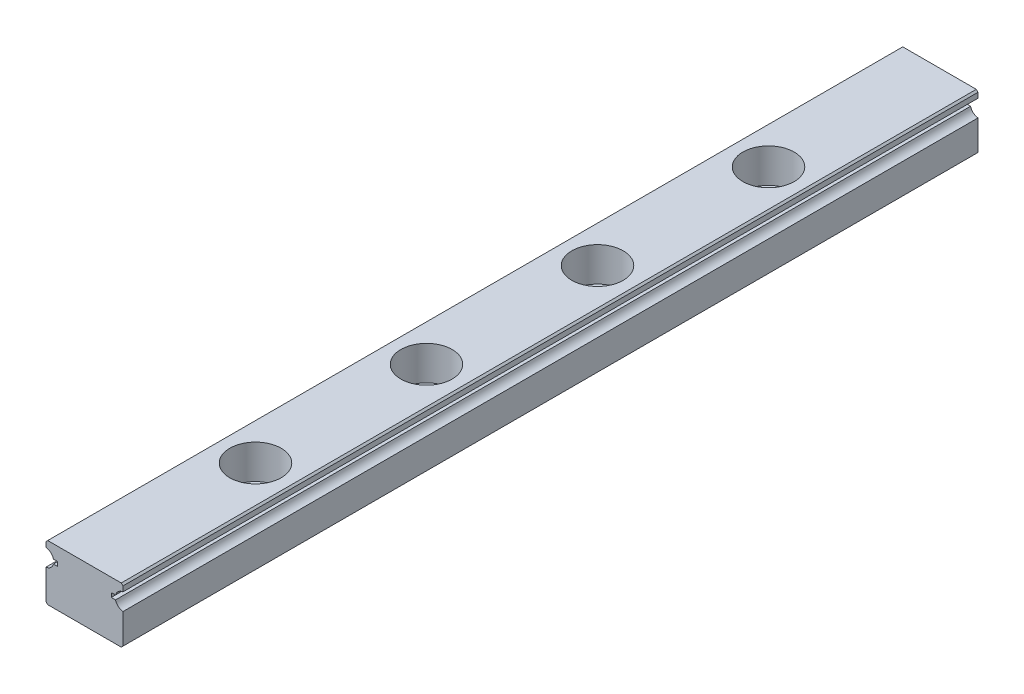
ISO-10303-21;
HEADER;
FILE_DESCRIPTION(('STEP AP214'),'2;1');
FILE_NAME('part.step','',(''),(''),'','','');
FILE_SCHEMA(('AUTOMOTIVE_DESIGN { 1 0 10303 214 1 1 1 1 }'));
ENDSEC;
DATA;
#1=APPLICATION_CONTEXT('core data for automotive mechanical design processes');
#2=APPLICATION_PROTOCOL_DEFINITION('international standard','automotive_design',2000,#1);
#3=PRODUCT_CONTEXT('',#1,'mechanical');
#4=PRODUCT('Part','Part','',(#3));
#5=PRODUCT_RELATED_PRODUCT_CATEGORY('part','',(#4));
#6=PRODUCT_DEFINITION_FORMATION('','',#4);
#7=PRODUCT_DEFINITION_CONTEXT('part definition',#1,'design');
#8=PRODUCT_DEFINITION('design','',#6,#7);
#9=PRODUCT_DEFINITION_SHAPE('','',#8);
#10=(LENGTH_UNIT() NAMED_UNIT(*) SI_UNIT(.MILLI.,.METRE.));
#11=(NAMED_UNIT(*) PLANE_ANGLE_UNIT() SI_UNIT($,.RADIAN.));
#12=(NAMED_UNIT(*) SI_UNIT($,.STERADIAN.) SOLID_ANGLE_UNIT());
#13=UNCERTAINTY_MEASURE_WITH_UNIT(LENGTH_MEASURE(1.E-05),#10,'distance_accuracy_value','');
#14=(GEOMETRIC_REPRESENTATION_CONTEXT(3) GLOBAL_UNCERTAINTY_ASSIGNED_CONTEXT((#13)) GLOBAL_UNIT_ASSIGNED_CONTEXT((#10,
#11,#12)) REPRESENTATION_CONTEXT('',''));
#15=CARTESIAN_POINT('',(0.,0.,0.));
#16=DIRECTION('',(0.,0.,1.));
#17=DIRECTION('',(1.,0.,0.));
#18=AXIS2_PLACEMENT_3D('',#15,#16,#17);
#19=CARTESIAN_POINT('',(-4.6,0.,100.));
#20=DIRECTION('',(0.,0.,-1.));
#21=DIRECTION('',(-1.,0.,0.));
#22=AXIS2_PLACEMENT_3D('',#19,#20,#21);
#23=CYLINDRICAL_SURFACE('',#22,1.);
#24=CARTESIAN_POINT('',(-4.6,0.,0.));
#25=DIRECTION('',(0.,0.,-1.));
#26=DIRECTION('',(-1.,0.,0.));
#27=AXIS2_PLACEMENT_3D('',#24,#25,#26);
#28=CIRCLE('',#27,1.);
#29=CARTESIAN_POINT('',(-4.5,0.99498743710662,0.));
#30=VERTEX_POINT('',#29);
#31=CARTESIAN_POINT('',(-3.63175416344815,0.25,0.));
#32=VERTEX_POINT('',#31);
#33=EDGE_CURVE('E206',#30,#32,#28,.T.);
#34=ORIENTED_EDGE('',*,*,#33,.T.);
#35=DIRECTION('',(0.,0.,-1.));
#36=VECTOR('',#35,1.);
#37=CARTESIAN_POINT('',(-3.63175416344815,0.25,100.));
#38=LINE('',#37,#36);
#39=CARTESIAN_POINT('',(-3.63175416344815,0.25,100.));
#40=VERTEX_POINT('',#39);
#41=EDGE_CURVE('E12',#40,#32,#38,.T.);
#42=ORIENTED_EDGE('',*,*,#41,.F.);
#43=CARTESIAN_POINT('',(-4.6,0.,100.));
#44=DIRECTION('',(0.,0.,-1.));
#45=DIRECTION('',(-1.,0.,0.));
#46=AXIS2_PLACEMENT_3D('',#43,#44,#45);
#47=CIRCLE('',#46,1.);
#48=CARTESIAN_POINT('',(-4.5,0.99498743710662,100.));
#49=VERTEX_POINT('',#48);
#50=EDGE_CURVE('E245',#49,#40,#47,.T.);
#51=ORIENTED_EDGE('',*,*,#50,.F.);
#52=DIRECTION('',(0.,0.,-1.));
#53=VECTOR('',#52,1.);
#54=CARTESIAN_POINT('',(-4.5,0.99498743710662,100.));
#55=LINE('',#54,#53);
#56=EDGE_CURVE('E202',#49,#30,#55,.T.);
#57=ORIENTED_EDGE('',*,*,#56,.T.);
#58=EDGE_LOOP('',(#34,#42,#51,#57));
#59=FACE_BOUND('',#58,.T.);
#60=ADVANCED_FACE('F38',(#59),#23,.F.);
#61=CARTESIAN_POINT('',(-3.63175416344815,0.25,100.));
#62=DIRECTION('',(0.,1.,0.));
#63=DIRECTION('',(-1.,0.,0.));
#64=AXIS2_PLACEMENT_3D('',#61,#62,#63);
#65=PLANE('',#64);
#66=DIRECTION('',(1.,0.,0.));
#67=VECTOR('',#66,1.);
#68=CARTESIAN_POINT('',(-3.63175416344815,0.25,0.));
#69=LINE('',#68,#67);
#70=CARTESIAN_POINT('',(-3.13175416344815,0.25,0.));
#71=VERTEX_POINT('',#70);
#72=EDGE_CURVE('E209',#32,#71,#69,.T.);
#73=ORIENTED_EDGE('',*,*,#72,.T.);
#74=DIRECTION('',(0.,0.,-1.));
#75=VECTOR('',#74,1.);
#76=CARTESIAN_POINT('',(-3.13175416344815,0.25,100.));
#77=LINE('',#76,#75);
#78=CARTESIAN_POINT('',(-3.13175416344815,0.25,100.));
#79=VERTEX_POINT('',#78);
#80=EDGE_CURVE('E46',#79,#71,#77,.T.);
#81=ORIENTED_EDGE('',*,*,#80,.F.);
#82=DIRECTION('',(1.,0.,0.));
#83=VECTOR('',#82,1.);
#84=CARTESIAN_POINT('',(-3.63175416344815,0.25,100.));
#85=LINE('',#84,#83);
#86=EDGE_CURVE('E133',#40,#79,#85,.T.);
#87=ORIENTED_EDGE('',*,*,#86,.F.);
#88=ORIENTED_EDGE('',*,*,#41,.T.);
#89=EDGE_LOOP('',(#73,#81,#87,#88));
#90=FACE_BOUND('',#89,.T.);
#91=ADVANCED_FACE('F363',(#90),#65,.F.);
#92=CARTESIAN_POINT('',(-3.13175416344815,-0.25,100.));
#93=DIRECTION('',(1.,0.,0.));
#94=DIRECTION('',(0.,0.,-1.));
#95=AXIS2_PLACEMENT_3D('',#92,#93,#94);
#96=PLANE('',#95);
#97=DIRECTION('',(0.,-1.,0.));
#98=VECTOR('',#97,1.);
#99=CARTESIAN_POINT('',(-3.13175416344815,-0.25,0.));
#100=LINE('',#99,#98);
#101=CARTESIAN_POINT('',(-3.13175416344815,-0.25,0.));
#102=VERTEX_POINT('',#101);
#103=EDGE_CURVE('E212',#71,#102,#100,.T.);
#104=ORIENTED_EDGE('',*,*,#103,.T.);
#105=DIRECTION('',(0.,0.,-1.));
#106=VECTOR('',#105,1.);
#107=CARTESIAN_POINT('',(-3.13175416344815,-0.25,100.));
#108=LINE('',#107,#106);
#109=CARTESIAN_POINT('',(-3.13175416344815,-0.25,100.));
#110=VERTEX_POINT('',#109);
#111=EDGE_CURVE('E288',#110,#102,#108,.T.);
#112=ORIENTED_EDGE('',*,*,#111,.F.);
#113=DIRECTION('',(0.,-1.,0.));
#114=VECTOR('',#113,1.);
#115=CARTESIAN_POINT('',(-3.13175416344815,-0.25,100.));
#116=LINE('',#115,#114);
#117=EDGE_CURVE('E296',#79,#110,#116,.T.);
#118=ORIENTED_EDGE('',*,*,#117,.F.);
#119=ORIENTED_EDGE('',*,*,#80,.T.);
#120=EDGE_LOOP('',(#104,#112,#118,#119));
#121=FACE_BOUND('',#120,.T.);
#122=ADVANCED_FACE('F294',(#121),#96,.F.);
#123=CARTESIAN_POINT('',(-3.63175416344815,-0.25,100.));
#124=DIRECTION('',(0.,-1.,0.));
#125=DIRECTION('',(0.,0.,-1.));
#126=AXIS2_PLACEMENT_3D('',#123,#124,#125);
#127=PLANE('',#126);
#128=DIRECTION('',(-1.,0.,0.));
#129=VECTOR('',#128,1.);
#130=CARTESIAN_POINT('',(-3.63175416344815,-0.25,0.));
#131=LINE('',#130,#129);
#132=CARTESIAN_POINT('',(-3.63175416344815,-0.25,0.));
#133=VERTEX_POINT('',#132);
#134=EDGE_CURVE('E214',#102,#133,#131,.T.);
#135=ORIENTED_EDGE('',*,*,#134,.T.);
#136=DIRECTION('',(0.,0.,-1.));
#137=VECTOR('',#136,1.);
#138=CARTESIAN_POINT('',(-3.63175416344815,-0.25,100.));
#139=LINE('',#138,#137);
#140=CARTESIAN_POINT('',(-3.63175416344815,-0.25,100.));
#141=VERTEX_POINT('',#140);
#142=EDGE_CURVE('E285',#141,#133,#139,.T.);
#143=ORIENTED_EDGE('',*,*,#142,.F.);
#144=DIRECTION('',(-1.,0.,0.));
#145=VECTOR('',#144,1.);
#146=CARTESIAN_POINT('',(-3.63175416344815,-0.25,100.));
#147=LINE('',#146,#145);
#148=EDGE_CURVE('E314',#110,#141,#147,.T.);
#149=ORIENTED_EDGE('',*,*,#148,.F.);
#150=ORIENTED_EDGE('',*,*,#111,.T.);
#151=EDGE_LOOP('',(#135,#143,#149,#150));
#152=FACE_BOUND('',#151,.T.);
#153=ADVANCED_FACE('F305',(#152),#127,.F.);
#154=CARTESIAN_POINT('',(-4.6,0.,100.));
#155=DIRECTION('',(0.,0.,-1.));
#156=DIRECTION('',(-1.,0.,0.));
#157=AXIS2_PLACEMENT_3D('',#154,#155,#156);
#158=CYLINDRICAL_SURFACE('',#157,1.);
#159=CARTESIAN_POINT('',(-4.6,0.,0.));
#160=DIRECTION('',(0.,0.,-1.));
#161=DIRECTION('',(-1.,0.,0.));
#162=AXIS2_PLACEMENT_3D('',#159,#160,#161);
#163=CIRCLE('',#162,1.);
#164=CARTESIAN_POINT('',(-4.5,-0.99498743710662,0.));
#165=VERTEX_POINT('',#164);
#166=EDGE_CURVE('E216',#133,#165,#163,.T.);
#167=ORIENTED_EDGE('',*,*,#166,.T.);
#168=DIRECTION('',(0.,0.,-1.));
#169=VECTOR('',#168,1.);
#170=CARTESIAN_POINT('',(-4.5,-0.99498743710662,100.));
#171=LINE('',#170,#169);
#172=CARTESIAN_POINT('',(-4.5,-0.99498743710662,100.));
#173=VERTEX_POINT('',#172);
#174=EDGE_CURVE('E282',#173,#165,#171,.T.);
#175=ORIENTED_EDGE('',*,*,#174,.F.);
#176=CARTESIAN_POINT('',(-4.6,0.,100.));
#177=DIRECTION('',(0.,0.,-1.));
#178=DIRECTION('',(-1.,0.,0.));
#179=AXIS2_PLACEMENT_3D('',#176,#177,#178);
#180=CIRCLE('',#179,1.);
#181=EDGE_CURVE('E311',#141,#173,#180,.T.);
#182=ORIENTED_EDGE('',*,*,#181,.F.);
#183=ORIENTED_EDGE('',*,*,#142,.T.);
#184=EDGE_LOOP('',(#167,#175,#182,#183));
#185=FACE_BOUND('',#184,.T.);
#186=ADVANCED_FACE('F309',(#185),#158,.F.);
#187=CARTESIAN_POINT('',(-4.5,-4.5,100.));
#188=DIRECTION('',(1.,0.,0.));
#189=DIRECTION('',(0.,1.,0.));
#190=AXIS2_PLACEMENT_3D('',#187,#188,#189);
#191=PLANE('',#190);
#192=DIRECTION('',(0.,-1.,0.));
#193=VECTOR('',#192,1.);
#194=CARTESIAN_POINT('',(-4.5,-4.5,0.));
#195=LINE('',#194,#193);
#196=CARTESIAN_POINT('',(-4.5,-4.5,0.));
#197=VERTEX_POINT('',#196);
#198=EDGE_CURVE('E218',#165,#197,#195,.T.);
#199=ORIENTED_EDGE('',*,*,#198,.T.);
#200=DIRECTION('',(0.,0.,-1.));
#201=VECTOR('',#200,1.);
#202=CARTESIAN_POINT('',(-4.5,-4.5,100.));
#203=LINE('',#202,#201);
#204=CARTESIAN_POINT('',(-4.5,-4.5,100.));
#205=VERTEX_POINT('',#204);
#206=EDGE_CURVE('E279',#205,#197,#203,.T.);
#207=ORIENTED_EDGE('',*,*,#206,.F.);
#208=DIRECTION('',(0.,-1.,0.));
#209=VECTOR('',#208,1.);
#210=CARTESIAN_POINT('',(-4.5,-4.5,100.));
#211=LINE('',#210,#209);
#212=EDGE_CURVE('E313',#173,#205,#211,.T.);
#213=ORIENTED_EDGE('',*,*,#212,.F.);
#214=ORIENTED_EDGE('',*,*,#174,.T.);
#215=EDGE_LOOP('',(#199,#207,#213,#214));
#216=FACE_BOUND('',#215,.T.);
#217=ADVANCED_FACE('F376',(#216),#191,.F.);
#218=CARTESIAN_POINT('',(-4.5,-4.5,100.));
#219=DIRECTION('',(0.707106781186547,0.707106781186547,0.));
#220=DIRECTION('',(-0.707106781186548,0.707106781186548,0.));
#221=AXIS2_PLACEMENT_3D('',#218,#219,#220);
#222=PLANE('',#221);
#223=DIRECTION('',(0.707106781186547,-0.707106781186547,0.));
#224=VECTOR('',#223,1.);
#225=CARTESIAN_POINT('',(-4.5,-4.5,0.));
#226=LINE('',#225,#224);
#227=CARTESIAN_POINT('',(-4.3,-4.7,0.));
#228=VERTEX_POINT('',#227);
#229=EDGE_CURVE('E220',#197,#228,#226,.T.);
#230=ORIENTED_EDGE('',*,*,#229,.T.);
#231=DIRECTION('',(0.,0.,-1.));
#232=VECTOR('',#231,1.);
#233=CARTESIAN_POINT('',(-4.3,-4.7,100.));
#234=LINE('',#233,#232);
#235=CARTESIAN_POINT('',(-4.3,-4.7,100.));
#236=VERTEX_POINT('',#235);
#237=EDGE_CURVE('E276',#236,#228,#234,.T.);
#238=ORIENTED_EDGE('',*,*,#237,.F.);
#239=DIRECTION('',(0.707106781186547,-0.707106781186547,0.));
#240=VECTOR('',#239,1.);
#241=CARTESIAN_POINT('',(-4.5,-4.5,100.));
#242=LINE('',#241,#240);
#243=EDGE_CURVE('E316',#205,#236,#242,.T.);
#244=ORIENTED_EDGE('',*,*,#243,.F.);
#245=ORIENTED_EDGE('',*,*,#206,.T.);
#246=EDGE_LOOP('',(#230,#238,#244,#245));
#247=FACE_BOUND('',#246,.T.);
#248=ADVANCED_FACE('F379',(#247),#222,.F.);
#249=CARTESIAN_POINT('',(-4.3,-4.7,100.));
#250=DIRECTION('',(0.,1.,0.));
#251=DIRECTION('',(-1.,0.,0.));
#252=AXIS2_PLACEMENT_3D('',#249,#250,#251);
#253=PLANE('',#252);
#254=CARTESIAN_POINT('',(0.,-4.7,80.));
#255=DIRECTION('',(0.,1.,0.));
#256=DIRECTION('',(-1.,0.,0.));
#257=AXIS2_PLACEMENT_3D('',#254,#255,#256);
#258=CIRCLE('',#257,1.75);
#259=CARTESIAN_POINT('',(-1.74999999999992,-4.7,80.));
#260=VERTEX_POINT('',#259);
#261=EDGE_CURVE('E612',#260,#260,#258,.T.);
#262=ORIENTED_EDGE('',*,*,#261,.T.);
#263=EDGE_LOOP('',(#262));
#264=FACE_BOUND('',#263,.T.);
#265=CARTESIAN_POINT('',(0.,-4.7,60.));
#266=DIRECTION('',(0.,1.,0.));
#267=DIRECTION('',(-1.,0.,0.));
#268=AXIS2_PLACEMENT_3D('',#265,#266,#267);
#269=CIRCLE('',#268,1.75);
#270=CARTESIAN_POINT('',(-1.74999999999996,-4.7,60.));
#271=VERTEX_POINT('',#270);
#272=EDGE_CURVE('E622',#271,#271,#269,.T.);
#273=ORIENTED_EDGE('',*,*,#272,.T.);
#274=EDGE_LOOP('',(#273));
#275=FACE_BOUND('',#274,.T.);
#276=CARTESIAN_POINT('',(0.,-4.7,20.));
#277=DIRECTION('',(0.,1.,0.));
#278=DIRECTION('',(-1.,0.,0.));
#279=AXIS2_PLACEMENT_3D('',#276,#277,#278);
#280=CIRCLE('',#279,1.75);
#281=CARTESIAN_POINT('',(-1.75000000000003,-4.7,20.));
#282=VERTEX_POINT('',#281);
#283=EDGE_CURVE('E441',#282,#282,#280,.T.);
#284=ORIENTED_EDGE('',*,*,#283,.T.);
#285=EDGE_LOOP('',(#284));
#286=FACE_BOUND('',#285,.T.);
#287=CARTESIAN_POINT('',(0.,-4.7,40.));
#288=DIRECTION('',(0.,1.,0.));
#289=DIRECTION('',(-1.,0.,0.));
#290=AXIS2_PLACEMENT_3D('',#287,#288,#289);
#291=CIRCLE('',#290,1.75);
#292=CARTESIAN_POINT('',(-1.75,-4.7,40.));
#293=VERTEX_POINT('',#292);
#294=EDGE_CURVE('E210',#293,#293,#291,.T.);
#295=ORIENTED_EDGE('',*,*,#294,.T.);
#296=EDGE_LOOP('',(#295));
#297=FACE_BOUND('',#296,.T.);
#298=DIRECTION('',(1.,0.,0.));
#299=VECTOR('',#298,1.);
#300=CARTESIAN_POINT('',(-4.3,-4.7,0.));
#301=LINE('',#300,#299);
#302=CARTESIAN_POINT('',(4.3,-4.7,0.));
#303=VERTEX_POINT('',#302);
#304=EDGE_CURVE('E222',#228,#303,#301,.T.);
#305=ORIENTED_EDGE('',*,*,#304,.T.);
#306=DIRECTION('',(0.,0.,-1.));
#307=VECTOR('',#306,1.);
#308=CARTESIAN_POINT('',(4.3,-4.7,100.));
#309=LINE('',#308,#307);
#310=CARTESIAN_POINT('',(4.3,-4.7,100.));
#311=VERTEX_POINT('',#310);
#312=EDGE_CURVE('E273',#311,#303,#309,.T.);
#313=ORIENTED_EDGE('',*,*,#312,.F.);
#314=DIRECTION('',(1.,0.,0.));
#315=VECTOR('',#314,1.);
#316=CARTESIAN_POINT('',(-4.3,-4.7,100.));
#317=LINE('',#316,#315);
#318=EDGE_CURVE('E322',#236,#311,#317,.T.);
#319=ORIENTED_EDGE('',*,*,#318,.F.);
#320=ORIENTED_EDGE('',*,*,#237,.T.);
#321=EDGE_LOOP('',(#305,#313,#319,#320));
#322=FACE_BOUND('',#321,.T.);
#323=ADVANCED_FACE('F383',(#264,#275,#286,#297,#322),#253,.F.);
#324=CARTESIAN_POINT('',(4.3,-4.7,100.));
#325=DIRECTION('',(-0.707106781186549,0.707106781186546,0.));
#326=DIRECTION('',(-0.707106781186546,-0.707106781186549,0.));
#327=AXIS2_PLACEMENT_3D('',#324,#325,#326);
#328=PLANE('',#327);
#329=DIRECTION('',(0.707106781186546,0.707106781186549,0.));
#330=VECTOR('',#329,1.);
#331=CARTESIAN_POINT('',(4.3,-4.7,0.));
#332=LINE('',#331,#330);
#333=CARTESIAN_POINT('',(4.5,-4.5,0.));
#334=VERTEX_POINT('',#333);
#335=EDGE_CURVE('E224',#303,#334,#332,.T.);
#336=ORIENTED_EDGE('',*,*,#335,.T.);
#337=DIRECTION('',(0.,0.,-1.));
#338=VECTOR('',#337,1.);
#339=CARTESIAN_POINT('',(4.5,-4.5,100.));
#340=LINE('',#339,#338);
#341=CARTESIAN_POINT('',(4.5,-4.5,100.));
#342=VERTEX_POINT('',#341);
#343=EDGE_CURVE('E270',#342,#334,#340,.T.);
#344=ORIENTED_EDGE('',*,*,#343,.F.);
#345=DIRECTION('',(0.707106781186546,0.707106781186549,0.));
#346=VECTOR('',#345,1.);
#347=CARTESIAN_POINT('',(4.3,-4.7,100.));
#348=LINE('',#347,#346);
#349=EDGE_CURVE('E324',#311,#342,#348,.T.);
#350=ORIENTED_EDGE('',*,*,#349,.F.);
#351=ORIENTED_EDGE('',*,*,#312,.T.);
#352=EDGE_LOOP('',(#336,#344,#350,#351));
#353=FACE_BOUND('',#352,.T.);
#354=ADVANCED_FACE('F387',(#353),#328,.F.);
#355=CARTESIAN_POINT('',(4.5,-4.5,100.));
#356=DIRECTION('',(-1.,0.,0.));
#357=DIRECTION('',(0.,-1.,0.));
#358=AXIS2_PLACEMENT_3D('',#355,#356,#357);
#359=PLANE('',#358);
#360=DIRECTION('',(0.,1.,0.));
#361=VECTOR('',#360,1.);
#362=CARTESIAN_POINT('',(4.5,-4.5,0.));
#363=LINE('',#362,#361);
#364=CARTESIAN_POINT('',(4.5,-0.99498743710662,0.));
#365=VERTEX_POINT('',#364);
#366=EDGE_CURVE('E226',#334,#365,#363,.T.);
#367=ORIENTED_EDGE('',*,*,#366,.T.);
#368=DIRECTION('',(0.,0.,-1.));
#369=VECTOR('',#368,1.);
#370=CARTESIAN_POINT('',(4.5,-0.99498743710662,100.));
#371=LINE('',#370,#369);
#372=CARTESIAN_POINT('',(4.5,-0.99498743710662,100.));
#373=VERTEX_POINT('',#372);
#374=EDGE_CURVE('E267',#373,#365,#371,.T.);
#375=ORIENTED_EDGE('',*,*,#374,.F.);
#376=DIRECTION('',(0.,1.,0.));
#377=VECTOR('',#376,1.);
#378=CARTESIAN_POINT('',(4.5,-4.5,100.));
#379=LINE('',#378,#377);
#380=EDGE_CURVE('E326',#342,#373,#379,.T.);
#381=ORIENTED_EDGE('',*,*,#380,.F.);
#382=ORIENTED_EDGE('',*,*,#343,.T.);
#383=EDGE_LOOP('',(#367,#375,#381,#382));
#384=FACE_BOUND('',#383,.T.);
#385=ADVANCED_FACE('F391',(#384),#359,.F.);
#386=CARTESIAN_POINT('',(4.6,0.,100.));
#387=DIRECTION('',(0.,0.,-1.));
#388=DIRECTION('',(-1.,0.,0.));
#389=AXIS2_PLACEMENT_3D('',#386,#387,#388);
#390=CYLINDRICAL_SURFACE('',#389,1.);
#391=CARTESIAN_POINT('',(4.6,0.,0.));
#392=DIRECTION('',(0.,0.,-1.));
#393=DIRECTION('',(1.,0.,0.));
#394=AXIS2_PLACEMENT_3D('',#391,#392,#393);
#395=CIRCLE('',#394,1.);
#396=CARTESIAN_POINT('',(3.63175416344815,-0.250000000000001,0.));
#397=VERTEX_POINT('',#396);
#398=EDGE_CURVE('E228',#365,#397,#395,.T.);
#399=ORIENTED_EDGE('',*,*,#398,.T.);
#400=DIRECTION('',(0.,0.,-1.));
#401=VECTOR('',#400,1.);
#402=CARTESIAN_POINT('',(3.63175416344815,-0.250000000000001,100.));
#403=LINE('',#402,#401);
#404=CARTESIAN_POINT('',(3.63175416344815,-0.250000000000001,100.));
#405=VERTEX_POINT('',#404);
#406=EDGE_CURVE('E264',#405,#397,#403,.T.);
#407=ORIENTED_EDGE('',*,*,#406,.F.);
#408=CARTESIAN_POINT('',(4.6,0.,100.));
#409=DIRECTION('',(0.,0.,-1.));
#410=DIRECTION('',(1.,0.,0.));
#411=AXIS2_PLACEMENT_3D('',#408,#409,#410);
#412=CIRCLE('',#411,1.);
#413=EDGE_CURVE('E328',#373,#405,#412,.T.);
#414=ORIENTED_EDGE('',*,*,#413,.F.);
#415=ORIENTED_EDGE('',*,*,#374,.T.);
#416=EDGE_LOOP('',(#399,#407,#414,#415));
#417=FACE_BOUND('',#416,.T.);
#418=ADVANCED_FACE('F395',(#417),#390,.F.);
#419=CARTESIAN_POINT('',(3.63175416344815,-0.250000000000001,100.));
#420=DIRECTION('',(0.,-1.,0.));
#421=DIRECTION('',(1.,0.,0.));
#422=AXIS2_PLACEMENT_3D('',#419,#420,#421);
#423=PLANE('',#422);
#424=DIRECTION('',(-1.,0.,0.));
#425=VECTOR('',#424,1.);
#426=CARTESIAN_POINT('',(3.63175416344815,-0.250000000000001,0.));
#427=LINE('',#426,#425);
#428=CARTESIAN_POINT('',(3.13175416344815,-0.249999999999999,0.));
#429=VERTEX_POINT('',#428);
#430=EDGE_CURVE('E230',#397,#429,#427,.T.);
#431=ORIENTED_EDGE('',*,*,#430,.T.);
#432=DIRECTION('',(0.,0.,-1.));
#433=VECTOR('',#432,1.);
#434=CARTESIAN_POINT('',(3.13175416344815,-0.249999999999999,100.));
#435=LINE('',#434,#433);
#436=CARTESIAN_POINT('',(3.13175416344815,-0.249999999999999,100.));
#437=VERTEX_POINT('',#436);
#438=EDGE_CURVE('E261',#437,#429,#435,.T.);
#439=ORIENTED_EDGE('',*,*,#438,.F.);
#440=DIRECTION('',(-1.,0.,0.));
#441=VECTOR('',#440,1.);
#442=CARTESIAN_POINT('',(3.63175416344815,-0.250000000000001,100.));
#443=LINE('',#442,#441);
#444=EDGE_CURVE('E330',#405,#437,#443,.T.);
#445=ORIENTED_EDGE('',*,*,#444,.F.);
#446=ORIENTED_EDGE('',*,*,#406,.T.);
#447=EDGE_LOOP('',(#431,#439,#445,#446));
#448=FACE_BOUND('',#447,.T.);
#449=ADVANCED_FACE('F399',(#448),#423,.F.);
#450=CARTESIAN_POINT('',(3.13175416344815,-0.249999999999999,100.));
#451=DIRECTION('',(-1.,0.,0.));
#452=DIRECTION('',(0.,0.,1.));
#453=AXIS2_PLACEMENT_3D('',#450,#451,#452);
#454=PLANE('',#453);
#455=DIRECTION('',(0.,1.,0.));
#456=VECTOR('',#455,1.);
#457=CARTESIAN_POINT('',(3.13175416344815,-0.249999999999999,0.));
#458=LINE('',#457,#456);
#459=CARTESIAN_POINT('',(3.13175416344815,0.249999999999999,0.));
#460=VERTEX_POINT('',#459);
#461=EDGE_CURVE('E232',#429,#460,#458,.T.);
#462=ORIENTED_EDGE('',*,*,#461,.T.);
#463=DIRECTION('',(0.,0.,-1.));
#464=VECTOR('',#463,1.);
#465=CARTESIAN_POINT('',(3.13175416344815,0.249999999999999,100.));
#466=LINE('',#465,#464);
#467=CARTESIAN_POINT('',(3.13175416344815,0.249999999999999,100.));
#468=VERTEX_POINT('',#467);
#469=EDGE_CURVE('E258',#468,#460,#466,.T.);
#470=ORIENTED_EDGE('',*,*,#469,.F.);
#471=DIRECTION('',(0.,1.,0.));
#472=VECTOR('',#471,1.);
#473=CARTESIAN_POINT('',(3.13175416344815,-0.249999999999999,100.));
#474=LINE('',#473,#472);
#475=EDGE_CURVE('E332',#437,#468,#474,.T.);
#476=ORIENTED_EDGE('',*,*,#475,.F.);
#477=ORIENTED_EDGE('',*,*,#438,.T.);
#478=EDGE_LOOP('',(#462,#470,#476,#477));
#479=FACE_BOUND('',#478,.T.);
#480=ADVANCED_FACE('F403',(#479),#454,.F.);
#481=CARTESIAN_POINT('',(3.63175416344815,0.250000000000001,100.));
#482=DIRECTION('',(0.,1.,0.));
#483=DIRECTION('',(-1.,0.,0.));
#484=AXIS2_PLACEMENT_3D('',#481,#482,#483);
#485=PLANE('',#484);
#486=DIRECTION('',(1.,0.,0.));
#487=VECTOR('',#486,1.);
#488=CARTESIAN_POINT('',(3.63175416344815,0.250000000000001,0.));
#489=LINE('',#488,#487);
#490=CARTESIAN_POINT('',(3.63175416344815,0.250000000000001,0.));
#491=VERTEX_POINT('',#490);
#492=EDGE_CURVE('E234',#460,#491,#489,.T.);
#493=ORIENTED_EDGE('',*,*,#492,.T.);
#494=DIRECTION('',(0.,0.,-1.));
#495=VECTOR('',#494,1.);
#496=CARTESIAN_POINT('',(3.63175416344815,0.250000000000001,100.));
#497=LINE('',#496,#495);
#498=CARTESIAN_POINT('',(3.63175416344815,0.250000000000001,100.));
#499=VERTEX_POINT('',#498);
#500=EDGE_CURVE('E255',#499,#491,#497,.T.);
#501=ORIENTED_EDGE('',*,*,#500,.F.);
#502=DIRECTION('',(1.,0.,0.));
#503=VECTOR('',#502,1.);
#504=CARTESIAN_POINT('',(3.63175416344815,0.250000000000001,100.));
#505=LINE('',#504,#503);
#506=EDGE_CURVE('E334',#468,#499,#505,.T.);
#507=ORIENTED_EDGE('',*,*,#506,.F.);
#508=ORIENTED_EDGE('',*,*,#469,.T.);
#509=EDGE_LOOP('',(#493,#501,#507,#508));
#510=FACE_BOUND('',#509,.T.);
#511=ADVANCED_FACE('F407',(#510),#485,.F.);
#512=CARTESIAN_POINT('',(4.6,0.,100.));
#513=DIRECTION('',(0.,0.,-1.));
#514=DIRECTION('',(-1.,0.,0.));
#515=AXIS2_PLACEMENT_3D('',#512,#513,#514);
#516=CYLINDRICAL_SURFACE('',#515,1.);
#517=CARTESIAN_POINT('',(4.6,0.,0.));
#518=DIRECTION('',(0.,0.,-1.));
#519=DIRECTION('',(1.,0.,0.));
#520=AXIS2_PLACEMENT_3D('',#517,#518,#519);
#521=CIRCLE('',#520,1.);
#522=CARTESIAN_POINT('',(4.5,0.994987437106621,0.));
#523=VERTEX_POINT('',#522);
#524=EDGE_CURVE('E236',#491,#523,#521,.T.);
#525=ORIENTED_EDGE('',*,*,#524,.T.);
#526=DIRECTION('',(0.,0.,-1.));
#527=VECTOR('',#526,1.);
#528=CARTESIAN_POINT('',(4.5,0.994987437106621,100.));
#529=LINE('',#528,#527);
#530=CARTESIAN_POINT('',(4.5,0.994987437106621,100.));
#531=VERTEX_POINT('',#530);
#532=EDGE_CURVE('E252',#531,#523,#529,.T.);
#533=ORIENTED_EDGE('',*,*,#532,.F.);
#534=CARTESIAN_POINT('',(4.6,0.,100.));
#535=DIRECTION('',(0.,0.,-1.));
#536=DIRECTION('',(1.,0.,0.));
#537=AXIS2_PLACEMENT_3D('',#534,#535,#536);
#538=CIRCLE('',#537,1.);
#539=EDGE_CURVE('E336',#499,#531,#538,.T.);
#540=ORIENTED_EDGE('',*,*,#539,.F.);
#541=ORIENTED_EDGE('',*,*,#500,.T.);
#542=EDGE_LOOP('',(#525,#533,#540,#541));
#543=FACE_BOUND('',#542,.T.);
#544=ADVANCED_FACE('F411',(#543),#516,.F.);
#545=CARTESIAN_POINT('',(4.5,0.994987437106621,100.));
#546=DIRECTION('',(-1.,0.,0.));
#547=DIRECTION('',(0.,-1.,0.));
#548=AXIS2_PLACEMENT_3D('',#545,#546,#547);
#549=PLANE('',#548);
#550=DIRECTION('',(0.,1.,0.));
#551=VECTOR('',#550,1.);
#552=CARTESIAN_POINT('',(4.5,0.994987437106621,0.));
#553=LINE('',#552,#551);
#554=CARTESIAN_POINT('',(4.5,1.6,0.));
#555=VERTEX_POINT('',#554);
#556=EDGE_CURVE('E238',#523,#555,#553,.T.);
#557=ORIENTED_EDGE('',*,*,#556,.T.);
#558=DIRECTION('',(0.,0.,-1.));
#559=VECTOR('',#558,1.);
#560=CARTESIAN_POINT('',(4.5,1.6,100.));
#561=LINE('',#560,#559);
#562=CARTESIAN_POINT('',(4.5,1.6,100.));
#563=VERTEX_POINT('',#562);
#564=EDGE_CURVE('E249',#563,#555,#561,.T.);
#565=ORIENTED_EDGE('',*,*,#564,.F.);
#566=DIRECTION('',(0.,1.,0.));
#567=VECTOR('',#566,1.);
#568=CARTESIAN_POINT('',(4.5,0.994987437106621,100.));
#569=LINE('',#568,#567);
#570=EDGE_CURVE('E338',#531,#563,#569,.T.);
#571=ORIENTED_EDGE('',*,*,#570,.F.);
#572=ORIENTED_EDGE('',*,*,#532,.T.);
#573=EDGE_LOOP('',(#557,#565,#571,#572));
#574=FACE_BOUND('',#573,.T.);
#575=ADVANCED_FACE('F344',(#574),#549,.F.);
#576=CARTESIAN_POINT('',(4.3,1.8,100.));
#577=DIRECTION('',(-0.707106781186546,-0.707106781186549,0.));
#578=DIRECTION('',(0.707106781186549,-0.707106781186546,0.));
#579=AXIS2_PLACEMENT_3D('',#576,#577,#578);
#580=PLANE('',#579);
#581=DIRECTION('',(-0.707106781186549,0.707106781186546,0.));
#582=VECTOR('',#581,1.);
#583=CARTESIAN_POINT('',(4.3,1.8,0.));
#584=LINE('',#583,#582);
#585=CARTESIAN_POINT('',(4.3,1.8,0.));
#586=VERTEX_POINT('',#585);
#587=EDGE_CURVE('E240',#555,#586,#584,.T.);
#588=ORIENTED_EDGE('',*,*,#587,.T.);
#589=DIRECTION('',(0.,0.,-1.));
#590=VECTOR('',#589,1.);
#591=CARTESIAN_POINT('',(4.3,1.8,100.));
#592=LINE('',#591,#590);
#593=CARTESIAN_POINT('',(4.3,1.8,100.));
#594=VERTEX_POINT('',#593);
#595=EDGE_CURVE('E197',#594,#586,#592,.T.);
#596=ORIENTED_EDGE('',*,*,#595,.F.);
#597=DIRECTION('',(-0.707106781186549,0.707106781186546,0.));
#598=VECTOR('',#597,1.);
#599=CARTESIAN_POINT('',(4.3,1.8,100.));
#600=LINE('',#599,#598);
#601=EDGE_CURVE('E188',#563,#594,#600,.T.);
#602=ORIENTED_EDGE('',*,*,#601,.F.);
#603=ORIENTED_EDGE('',*,*,#564,.T.);
#604=EDGE_LOOP('',(#588,#596,#602,#603));
#605=FACE_BOUND('',#604,.T.);
#606=ADVANCED_FACE('F348',(#605),#580,.F.);
#607=CARTESIAN_POINT('',(-4.3,1.8,100.));
#608=DIRECTION('',(0.,-1.,0.));
#609=DIRECTION('',(0.,0.,-1.));
#610=AXIS2_PLACEMENT_3D('',#607,#608,#609);
#611=PLANE('',#610);
#612=CARTESIAN_POINT('',(0.,1.8,80.));
#613=DIRECTION('',(0.,1.,0.));
#614=DIRECTION('',(0.,0.,1.));
#615=AXIS2_PLACEMENT_3D('',#612,#613,#614);
#616=CIRCLE('',#615,3.);
#617=CARTESIAN_POINT('',(0.,1.8,83.));
#618=VERTEX_POINT('',#617);
#619=EDGE_CURVE('E427',#618,#618,#616,.T.);
#620=ORIENTED_EDGE('',*,*,#619,.F.);
#621=EDGE_LOOP('',(#620));
#622=FACE_BOUND('',#621,.T.);
#623=CARTESIAN_POINT('',(0.,1.8,60.));
#624=DIRECTION('',(0.,1.,0.));
#625=DIRECTION('',(0.,0.,1.));
#626=AXIS2_PLACEMENT_3D('',#623,#624,#625);
#627=CIRCLE('',#626,3.);
#628=CARTESIAN_POINT('',(0.,1.8,63.));
#629=VERTEX_POINT('',#628);
#630=EDGE_CURVE('E431',#629,#629,#627,.T.);
#631=ORIENTED_EDGE('',*,*,#630,.F.);
#632=EDGE_LOOP('',(#631));
#633=FACE_BOUND('',#632,.T.);
#634=CARTESIAN_POINT('',(0.,1.8,20.));
#635=DIRECTION('',(0.,1.,0.));
#636=DIRECTION('',(0.,0.,1.));
#637=AXIS2_PLACEMENT_3D('',#634,#635,#636);
#638=CIRCLE('',#637,3.);
#639=CARTESIAN_POINT('',(0.,1.8,23.));
#640=VERTEX_POINT('',#639);
#641=EDGE_CURVE('E435',#640,#640,#638,.T.);
#642=ORIENTED_EDGE('',*,*,#641,.F.);
#643=EDGE_LOOP('',(#642));
#644=FACE_BOUND('',#643,.T.);
#645=CARTESIAN_POINT('',(0.,1.8,40.));
#646=DIRECTION('',(0.,1.,0.));
#647=DIRECTION('',(0.,0.,1.));
#648=AXIS2_PLACEMENT_3D('',#645,#646,#647);
#649=CIRCLE('',#648,3.);
#650=CARTESIAN_POINT('',(0.,1.8,43.));
#651=VERTEX_POINT('',#650);
#652=EDGE_CURVE('E438',#651,#651,#649,.T.);
#653=ORIENTED_EDGE('',*,*,#652,.F.);
#654=EDGE_LOOP('',(#653));
#655=FACE_BOUND('',#654,.T.);
#656=DIRECTION('',(-1.,0.,0.));
#657=VECTOR('',#656,1.);
#658=CARTESIAN_POINT('',(-4.3,1.8,0.));
#659=LINE('',#658,#657);
#660=CARTESIAN_POINT('',(-4.3,1.8,0.));
#661=VERTEX_POINT('',#660);
#662=EDGE_CURVE('E196',#586,#661,#659,.T.);
#663=ORIENTED_EDGE('',*,*,#662,.T.);
#664=DIRECTION('',(0.,0.,-1.));
#665=VECTOR('',#664,1.);
#666=CARTESIAN_POINT('',(-4.3,1.8,100.));
#667=LINE('',#666,#665);
#668=CARTESIAN_POINT('',(-4.3,1.8,100.));
#669=VERTEX_POINT('',#668);
#670=EDGE_CURVE('E193',#669,#661,#667,.T.);
#671=ORIENTED_EDGE('',*,*,#670,.F.);
#672=DIRECTION('',(-1.,0.,0.));
#673=VECTOR('',#672,1.);
#674=CARTESIAN_POINT('',(-4.3,1.8,100.));
#675=LINE('',#674,#673);
#676=EDGE_CURVE('E182',#594,#669,#675,.T.);
#677=ORIENTED_EDGE('',*,*,#676,.F.);
#678=ORIENTED_EDGE('',*,*,#595,.T.);
#679=EDGE_LOOP('',(#663,#671,#677,#678));
#680=FACE_BOUND('',#679,.T.);
#681=ADVANCED_FACE('F194',(#622,#633,#644,#655,#680),#611,.F.);
#682=CARTESIAN_POINT('',(-4.5,1.6,100.));
#683=DIRECTION('',(0.70710678118655,-0.707106781186545,0.));
#684=DIRECTION('',(0.707106781186545,0.70710678118655,0.));
#685=AXIS2_PLACEMENT_3D('',#682,#683,#684);
#686=PLANE('',#685);
#687=DIRECTION('',(-0.707106781186545,-0.70710678118655,0.));
#688=VECTOR('',#687,1.);
#689=CARTESIAN_POINT('',(-4.5,1.6,0.));
#690=LINE('',#689,#688);
#691=CARTESIAN_POINT('',(-4.5,1.6,0.));
#692=VERTEX_POINT('',#691);
#693=EDGE_CURVE('E119',#661,#692,#690,.T.);
#694=ORIENTED_EDGE('',*,*,#693,.T.);
#695=DIRECTION('',(0.,0.,-1.));
#696=VECTOR('',#695,1.);
#697=CARTESIAN_POINT('',(-4.5,1.6,100.));
#698=LINE('',#697,#696);
#699=CARTESIAN_POINT('',(-4.5,1.6,100.));
#700=VERTEX_POINT('',#699);
#701=EDGE_CURVE('E198',#700,#692,#698,.T.);
#702=ORIENTED_EDGE('',*,*,#701,.F.);
#703=DIRECTION('',(-0.707106781186545,-0.70710678118655,0.));
#704=VECTOR('',#703,1.);
#705=CARTESIAN_POINT('',(-4.5,1.6,100.));
#706=LINE('',#705,#704);
#707=EDGE_CURVE('E186',#669,#700,#706,.T.);
#708=ORIENTED_EDGE('',*,*,#707,.F.);
#709=ORIENTED_EDGE('',*,*,#670,.T.);
#710=EDGE_LOOP('',(#694,#702,#708,#709));
#711=FACE_BOUND('',#710,.T.);
#712=ADVANCED_FACE('F200',(#711),#686,.F.);
#713=CARTESIAN_POINT('',(-4.5,0.99498743710662,100.));
#714=DIRECTION('',(1.,0.,0.));
#715=DIRECTION('',(0.,0.,-1.));
#716=AXIS2_PLACEMENT_3D('',#713,#714,#715);
#717=PLANE('',#716);
#718=DIRECTION('',(0.,-1.,0.));
#719=VECTOR('',#718,1.);
#720=CARTESIAN_POINT('',(-4.5,0.99498743710662,0.));
#721=LINE('',#720,#719);
#722=EDGE_CURVE('E125',#692,#30,#721,.T.);
#723=ORIENTED_EDGE('',*,*,#722,.T.);
#724=ORIENTED_EDGE('',*,*,#56,.F.);
#725=DIRECTION('',(0.,-1.,0.));
#726=VECTOR('',#725,1.);
#727=CARTESIAN_POINT('',(-4.5,0.99498743710662,100.));
#728=LINE('',#727,#726);
#729=EDGE_CURVE('E54',#700,#49,#728,.T.);
#730=ORIENTED_EDGE('',*,*,#729,.F.);
#731=ORIENTED_EDGE('',*,*,#701,.T.);
#732=EDGE_LOOP('',(#723,#724,#730,#731));
#733=FACE_BOUND('',#732,.T.);
#734=ADVANCED_FACE('F352',(#733),#717,.F.);
#735=CARTESIAN_POINT('',(-4.6,0.,100.));
#736=DIRECTION('',(0.,0.,-1.));
#737=DIRECTION('',(-1.,0.,0.));
#738=AXIS2_PLACEMENT_3D('',#735,#736,#737);
#739=PLANE('',#738);
#740=ORIENTED_EDGE('',*,*,#50,.T.);
#741=ORIENTED_EDGE('',*,*,#86,.T.);
#742=ORIENTED_EDGE('',*,*,#117,.T.);
#743=ORIENTED_EDGE('',*,*,#148,.T.);
#744=ORIENTED_EDGE('',*,*,#181,.T.);
#745=ORIENTED_EDGE('',*,*,#212,.T.);
#746=ORIENTED_EDGE('',*,*,#243,.T.);
#747=ORIENTED_EDGE('',*,*,#318,.T.);
#748=ORIENTED_EDGE('',*,*,#349,.T.);
#749=ORIENTED_EDGE('',*,*,#380,.T.);
#750=ORIENTED_EDGE('',*,*,#413,.T.);
#751=ORIENTED_EDGE('',*,*,#444,.T.);
#752=ORIENTED_EDGE('',*,*,#475,.T.);
#753=ORIENTED_EDGE('',*,*,#506,.T.);
#754=ORIENTED_EDGE('',*,*,#539,.T.);
#755=ORIENTED_EDGE('',*,*,#570,.T.);
#756=ORIENTED_EDGE('',*,*,#601,.T.);
#757=ORIENTED_EDGE('',*,*,#676,.T.);
#758=ORIENTED_EDGE('',*,*,#707,.T.);
#759=ORIENTED_EDGE('',*,*,#729,.T.);
#760=EDGE_LOOP('',(#740,#741,#742,#743,#744,#745,#746,#747,#748,#749,#750,#751,#752,#753,#754,
#755,#756,#757,#758,#759));
#761=FACE_BOUND('',#760,.T.);
#762=ADVANCED_FACE('F184',(#761),#739,.F.);
#763=CARTESIAN_POINT('',(-4.6,0.,0.));
#764=DIRECTION('',(0.,0.,-1.));
#765=DIRECTION('',(-1.,0.,0.));
#766=AXIS2_PLACEMENT_3D('',#763,#764,#765);
#767=PLANE('',#766);
#768=ORIENTED_EDGE('',*,*,#33,.F.);
#769=ORIENTED_EDGE('',*,*,#722,.F.);
#770=ORIENTED_EDGE('',*,*,#693,.F.);
#771=ORIENTED_EDGE('',*,*,#662,.F.);
#772=ORIENTED_EDGE('',*,*,#587,.F.);
#773=ORIENTED_EDGE('',*,*,#556,.F.);
#774=ORIENTED_EDGE('',*,*,#524,.F.);
#775=ORIENTED_EDGE('',*,*,#492,.F.);
#776=ORIENTED_EDGE('',*,*,#461,.F.);
#777=ORIENTED_EDGE('',*,*,#430,.F.);
#778=ORIENTED_EDGE('',*,*,#398,.F.);
#779=ORIENTED_EDGE('',*,*,#366,.F.);
#780=ORIENTED_EDGE('',*,*,#335,.F.);
#781=ORIENTED_EDGE('',*,*,#304,.F.);
#782=ORIENTED_EDGE('',*,*,#229,.F.);
#783=ORIENTED_EDGE('',*,*,#198,.F.);
#784=ORIENTED_EDGE('',*,*,#166,.F.);
#785=ORIENTED_EDGE('',*,*,#134,.F.);
#786=ORIENTED_EDGE('',*,*,#103,.F.);
#787=ORIENTED_EDGE('',*,*,#72,.F.);
#788=EDGE_LOOP('',(#768,#769,#770,#771,#772,#773,#774,#775,#776,#777,#778,#779,#780,#781,#782,
#783,#784,#785,#786,#787));
#789=FACE_BOUND('',#788,.T.);
#790=ADVANCED_FACE('F300',(#789),#767,.T.);
#791=CARTESIAN_POINT('',(0.,1.8,40.));
#792=DIRECTION('',(0.,1.,0.));
#793=DIRECTION('',(0.,0.,1.));
#794=AXIS2_PLACEMENT_3D('',#791,#792,#793);
#795=CYLINDRICAL_SURFACE('',#794,1.75);
#796=ORIENTED_EDGE('',*,*,#294,.F.);
#797=EDGE_LOOP('',(#796));
#798=FACE_BOUND('',#797,.T.);
#799=CARTESIAN_POINT('',(0.,-2.2,40.));
#800=DIRECTION('',(0.,1.,0.));
#801=DIRECTION('',(0.,0.,1.));
#802=AXIS2_PLACEMENT_3D('',#799,#800,#801);
#803=CIRCLE('',#802,1.75);
#804=CARTESIAN_POINT('',(0.,-2.2,41.75));
#805=VERTEX_POINT('',#804);
#806=EDGE_CURVE('E444',#805,#805,#803,.T.);
#807=ORIENTED_EDGE('',*,*,#806,.T.);
#808=EDGE_LOOP('',(#807));
#809=FACE_BOUND('',#808,.T.);
#810=ADVANCED_FACE('F460',(#798,#809),#795,.F.);
#811=CARTESIAN_POINT('',(1.75,-2.2,40.));
#812=DIRECTION('',(0.,-1.,0.));
#813=DIRECTION('',(0.,0.,-1.));
#814=AXIS2_PLACEMENT_3D('',#811,#812,#813);
#815=PLANE('',#814);
#816=ORIENTED_EDGE('',*,*,#806,.F.);
#817=EDGE_LOOP('',(#816));
#818=FACE_BOUND('',#817,.T.);
#819=CARTESIAN_POINT('',(0.,-2.2,40.));
#820=DIRECTION('',(0.,1.,0.));
#821=DIRECTION('',(0.,0.,1.));
#822=AXIS2_PLACEMENT_3D('',#819,#820,#821);
#823=CIRCLE('',#822,3.);
#824=CARTESIAN_POINT('',(0.,-2.2,43.));
#825=VERTEX_POINT('',#824);
#826=EDGE_CURVE('E440',#825,#825,#823,.T.);
#827=ORIENTED_EDGE('',*,*,#826,.T.);
#828=EDGE_LOOP('',(#827));
#829=FACE_BOUND('',#828,.T.);
#830=ADVANCED_FACE('F463',(#818,#829),#815,.F.);
#831=CARTESIAN_POINT('',(0.,1.8,40.));
#832=DIRECTION('',(0.,1.,0.));
#833=DIRECTION('',(0.,0.,1.));
#834=AXIS2_PLACEMENT_3D('',#831,#832,#833);
#835=CYLINDRICAL_SURFACE('',#834,3.);
#836=ORIENTED_EDGE('',*,*,#826,.F.);
#837=EDGE_LOOP('',(#836));
#838=FACE_BOUND('',#837,.T.);
#839=ORIENTED_EDGE('',*,*,#652,.T.);
#840=EDGE_LOOP('',(#839));
#841=FACE_BOUND('',#840,.T.);
#842=ADVANCED_FACE('F469',(#838,#841),#835,.F.);
#843=CARTESIAN_POINT('',(0.,1.8,20.));
#844=DIRECTION('',(0.,1.,0.));
#845=DIRECTION('',(0.,0.,1.));
#846=AXIS2_PLACEMENT_3D('',#843,#844,#845);
#847=CYLINDRICAL_SURFACE('',#846,1.75);
#848=ORIENTED_EDGE('',*,*,#283,.F.);
#849=EDGE_LOOP('',(#848));
#850=FACE_BOUND('',#849,.T.);
#851=CARTESIAN_POINT('',(0.,-2.2,20.));
#852=DIRECTION('',(0.,1.,0.));
#853=DIRECTION('',(0.,0.,1.));
#854=AXIS2_PLACEMENT_3D('',#851,#852,#853);
#855=CIRCLE('',#854,1.75);
#856=CARTESIAN_POINT('',(0.,-2.2,21.75));
#857=VERTEX_POINT('',#856);
#858=EDGE_CURVE('E447',#857,#857,#855,.T.);
#859=ORIENTED_EDGE('',*,*,#858,.T.);
#860=EDGE_LOOP('',(#859));
#861=FACE_BOUND('',#860,.T.);
#862=ADVANCED_FACE('F474',(#850,#861),#847,.F.);
#863=CARTESIAN_POINT('',(1.74999999999996,-2.2,20.));
#864=DIRECTION('',(0.,-1.,0.));
#865=DIRECTION('',(0.,0.,-1.));
#866=AXIS2_PLACEMENT_3D('',#863,#864,#865);
#867=PLANE('',#866);
#868=ORIENTED_EDGE('',*,*,#858,.F.);
#869=EDGE_LOOP('',(#868));
#870=FACE_BOUND('',#869,.T.);
#871=CARTESIAN_POINT('',(0.,-2.2,20.));
#872=DIRECTION('',(0.,1.,0.));
#873=DIRECTION('',(0.,0.,1.));
#874=AXIS2_PLACEMENT_3D('',#871,#872,#873);
#875=CIRCLE('',#874,3.);
#876=CARTESIAN_POINT('',(0.,-2.2,23.));
#877=VERTEX_POINT('',#876);
#878=EDGE_CURVE('E626',#877,#877,#875,.T.);
#879=ORIENTED_EDGE('',*,*,#878,.T.);
#880=EDGE_LOOP('',(#879));
#881=FACE_BOUND('',#880,.T.);
#882=ADVANCED_FACE('F479',(#870,#881),#867,.F.);
#883=CARTESIAN_POINT('',(0.,1.8,20.));
#884=DIRECTION('',(0.,1.,0.));
#885=DIRECTION('',(0.,0.,1.));
#886=AXIS2_PLACEMENT_3D('',#883,#884,#885);
#887=CYLINDRICAL_SURFACE('',#886,3.);
#888=ORIENTED_EDGE('',*,*,#878,.F.);
#889=EDGE_LOOP('',(#888));
#890=FACE_BOUND('',#889,.T.);
#891=ORIENTED_EDGE('',*,*,#641,.T.);
#892=EDGE_LOOP('',(#891));
#893=FACE_BOUND('',#892,.T.);
#894=ADVANCED_FACE('F529',(#890,#893),#887,.F.);
#895=CARTESIAN_POINT('',(0.,1.8,60.));
#896=DIRECTION('',(0.,1.,0.));
#897=DIRECTION('',(0.,0.,1.));
#898=AXIS2_PLACEMENT_3D('',#895,#896,#897);
#899=CYLINDRICAL_SURFACE('',#898,1.75);
#900=ORIENTED_EDGE('',*,*,#272,.F.);
#901=EDGE_LOOP('',(#900));
#902=FACE_BOUND('',#901,.T.);
#903=CARTESIAN_POINT('',(0.,-2.2,60.));
#904=DIRECTION('',(0.,1.,0.));
#905=DIRECTION('',(0.,0.,1.));
#906=AXIS2_PLACEMENT_3D('',#903,#904,#905);
#907=CIRCLE('',#906,1.75);
#908=CARTESIAN_POINT('',(0.,-2.2,61.75));
#909=VERTEX_POINT('',#908);
#910=EDGE_CURVE('E619',#909,#909,#907,.T.);
#911=ORIENTED_EDGE('',*,*,#910,.T.);
#912=EDGE_LOOP('',(#911));
#913=FACE_BOUND('',#912,.T.);
#914=ADVANCED_FACE('F538',(#902,#913),#899,.F.);
#915=CARTESIAN_POINT('',(1.75000000000003,-2.2,60.));
#916=DIRECTION('',(0.,-1.,0.));
#917=DIRECTION('',(0.,0.,-1.));
#918=AXIS2_PLACEMENT_3D('',#915,#916,#917);
#919=PLANE('',#918);
#920=ORIENTED_EDGE('',*,*,#910,.F.);
#921=EDGE_LOOP('',(#920));
#922=FACE_BOUND('',#921,.T.);
#923=CARTESIAN_POINT('',(0.,-2.2,60.));
#924=DIRECTION('',(0.,1.,0.));
#925=DIRECTION('',(0.,0.,1.));
#926=AXIS2_PLACEMENT_3D('',#923,#924,#925);
#927=CIRCLE('',#926,3.);
#928=CARTESIAN_POINT('',(0.,-2.2,63.));
#929=VERTEX_POINT('',#928);
#930=EDGE_CURVE('E616',#929,#929,#927,.T.);
#931=ORIENTED_EDGE('',*,*,#930,.T.);
#932=EDGE_LOOP('',(#931));
#933=FACE_BOUND('',#932,.T.);
#934=ADVANCED_FACE('F548',(#922,#933),#919,.F.);
#935=CARTESIAN_POINT('',(0.,1.8,60.));
#936=DIRECTION('',(0.,1.,0.));
#937=DIRECTION('',(0.,0.,1.));
#938=AXIS2_PLACEMENT_3D('',#935,#936,#937);
#939=CYLINDRICAL_SURFACE('',#938,3.);
#940=ORIENTED_EDGE('',*,*,#930,.F.);
#941=EDGE_LOOP('',(#940));
#942=FACE_BOUND('',#941,.T.);
#943=ORIENTED_EDGE('',*,*,#630,.T.);
#944=EDGE_LOOP('',(#943));
#945=FACE_BOUND('',#944,.T.);
#946=ADVANCED_FACE('F558',(#942,#945),#939,.F.);
#947=CARTESIAN_POINT('',(0.,1.8,80.));
#948=DIRECTION('',(0.,1.,0.));
#949=DIRECTION('',(0.,0.,1.));
#950=AXIS2_PLACEMENT_3D('',#947,#948,#949);
#951=CYLINDRICAL_SURFACE('',#950,1.75);
#952=ORIENTED_EDGE('',*,*,#261,.F.);
#953=EDGE_LOOP('',(#952));
#954=FACE_BOUND('',#953,.T.);
#955=CARTESIAN_POINT('',(0.,-2.2,80.));
#956=DIRECTION('',(0.,1.,0.));
#957=DIRECTION('',(0.,0.,1.));
#958=AXIS2_PLACEMENT_3D('',#955,#956,#957);
#959=CIRCLE('',#958,1.75);
#960=CARTESIAN_POINT('',(0.,-2.2,81.75));
#961=VERTEX_POINT('',#960);
#962=EDGE_CURVE('E607',#961,#961,#959,.T.);
#963=ORIENTED_EDGE('',*,*,#962,.T.);
#964=EDGE_LOOP('',(#963));
#965=FACE_BOUND('',#964,.T.);
#966=ADVANCED_FACE('F568',(#954,#965),#951,.F.);
#967=CARTESIAN_POINT('',(1.75000000000008,-2.2,80.));
#968=DIRECTION('',(0.,-1.,0.));
#969=DIRECTION('',(0.,0.,-1.));
#970=AXIS2_PLACEMENT_3D('',#967,#968,#969);
#971=PLANE('',#970);
#972=ORIENTED_EDGE('',*,*,#962,.F.);
#973=EDGE_LOOP('',(#972));
#974=FACE_BOUND('',#973,.T.);
#975=CARTESIAN_POINT('',(0.,-2.2,80.));
#976=DIRECTION('',(0.,1.,0.));
#977=DIRECTION('',(0.,0.,1.));
#978=AXIS2_PLACEMENT_3D('',#975,#976,#977);
#979=CIRCLE('',#978,3.);
#980=CARTESIAN_POINT('',(0.,-2.2,83.));
#981=VERTEX_POINT('',#980);
#982=EDGE_CURVE('E605',#981,#981,#979,.T.);
#983=ORIENTED_EDGE('',*,*,#982,.T.);
#984=EDGE_LOOP('',(#983));
#985=FACE_BOUND('',#984,.T.);
#986=ADVANCED_FACE('F578',(#974,#985),#971,.F.);
#987=CARTESIAN_POINT('',(0.,1.8,80.));
#988=DIRECTION('',(0.,1.,0.));
#989=DIRECTION('',(0.,0.,1.));
#990=AXIS2_PLACEMENT_3D('',#987,#988,#989);
#991=CYLINDRICAL_SURFACE('',#990,3.);
#992=ORIENTED_EDGE('',*,*,#982,.F.);
#993=EDGE_LOOP('',(#992));
#994=FACE_BOUND('',#993,.T.);
#995=ORIENTED_EDGE('',*,*,#619,.T.);
#996=EDGE_LOOP('',(#995));
#997=FACE_BOUND('',#996,.T.);
#998=ADVANCED_FACE('F588',(#994,#997),#991,.F.);
#999=CLOSED_SHELL('',(#60,#91,#122,#153,#186,#217,#248,#323,#354,#385,#418,#449,#480,#511,#544,
#575,#606,#681,#712,#734,#762,#790,#810,#830,#842,#862,#882,#894,#914,#934,#946,#966,#986,#998));
#1000=MANIFOLD_SOLID_BREP('B2',#999);
#1001=ADVANCED_BREP_SHAPE_REPRESENTATION('',(#18,#1000),#14);
#1002=SHAPE_DEFINITION_REPRESENTATION(#9,#1001);
ENDSEC;
END-ISO-10303-21;
